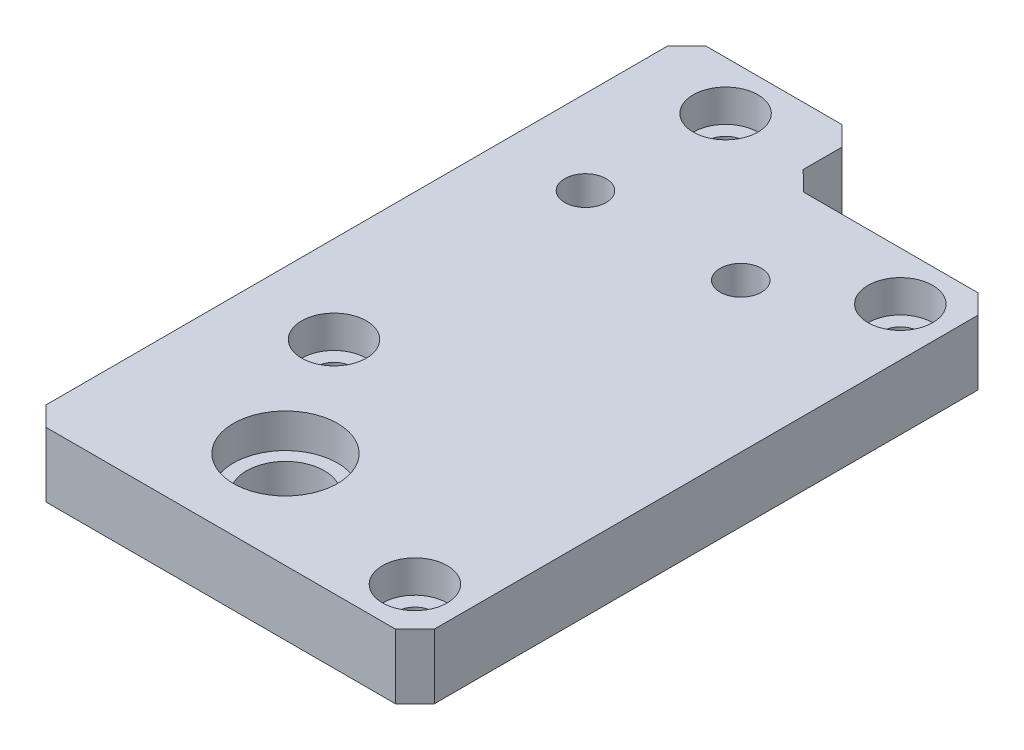
ISO-10303-21;
HEADER;
FILE_DESCRIPTION(('STEP AP214'),'2;1');
FILE_NAME('part.step','',(''),(''),'','','');
FILE_SCHEMA(('AUTOMOTIVE_DESIGN { 1 0 10303 214 1 1 1 1 }'));
ENDSEC;
DATA;
#1=APPLICATION_CONTEXT('core data for automotive mechanical design processes');
#2=APPLICATION_PROTOCOL_DEFINITION('international standard','automotive_design',2000,#1);
#3=PRODUCT_CONTEXT('',#1,'mechanical');
#4=PRODUCT('Part','Part','',(#3));
#5=PRODUCT_RELATED_PRODUCT_CATEGORY('part','',(#4));
#6=PRODUCT_DEFINITION_FORMATION('','',#4);
#7=PRODUCT_DEFINITION_CONTEXT('part definition',#1,'design');
#8=PRODUCT_DEFINITION('design','',#6,#7);
#9=PRODUCT_DEFINITION_SHAPE('','',#8);
#10=(LENGTH_UNIT() NAMED_UNIT(*) SI_UNIT(.MILLI.,.METRE.));
#11=(NAMED_UNIT(*) PLANE_ANGLE_UNIT() SI_UNIT($,.RADIAN.));
#12=(NAMED_UNIT(*) SI_UNIT($,.STERADIAN.) SOLID_ANGLE_UNIT());
#13=UNCERTAINTY_MEASURE_WITH_UNIT(LENGTH_MEASURE(1.E-05),#10,'distance_accuracy_value','');
#14=(GEOMETRIC_REPRESENTATION_CONTEXT(3) GLOBAL_UNCERTAINTY_ASSIGNED_CONTEXT((#13)) GLOBAL_UNIT_ASSIGNED_CONTEXT((#10,
#11,#12)) REPRESENTATION_CONTEXT('',''));
#15=CARTESIAN_POINT('',(0.,0.,0.));
#16=DIRECTION('',(0.,0.,1.));
#17=DIRECTION('',(1.,0.,0.));
#18=AXIS2_PLACEMENT_3D('',#15,#16,#17);
#19=CARTESIAN_POINT('',(35.,10.,-135.));
#20=DIRECTION('',(-1.,0.,0.));
#21=DIRECTION('',(0.,0.,-1.));
#22=AXIS2_PLACEMENT_3D('',#19,#20,#21);
#23=PLANE('',#22);
#24=DIRECTION('',(0.,0.,1.));
#25=VECTOR('',#24,1.);
#26=CARTESIAN_POINT('',(35.,0.,-135.));
#27=LINE('',#26,#25);
#28=CARTESIAN_POINT('',(35.,0.,-132.));
#29=VERTEX_POINT('',#28);
#30=CARTESIAN_POINT('',(35.,0.,-48.0000000000001));
#31=VERTEX_POINT('',#30);
#32=EDGE_CURVE('E143',#29,#31,#27,.T.);
#33=ORIENTED_EDGE('',*,*,#32,.F.);
#34=DIRECTION('',(0.,-1.,0.));
#35=VECTOR('',#34,1.);
#36=CARTESIAN_POINT('',(35.,10.,-132.));
#37=LINE('',#36,#35);
#38=CARTESIAN_POINT('',(35.,10.,-132.));
#39=VERTEX_POINT('',#38);
#40=EDGE_CURVE('E148',#39,#29,#37,.T.);
#41=ORIENTED_EDGE('',*,*,#40,.F.);
#42=DIRECTION('',(0.,0.,1.));
#43=VECTOR('',#42,1.);
#44=CARTESIAN_POINT('',(35.,10.,-135.));
#45=LINE('',#44,#43);
#46=CARTESIAN_POINT('',(35.,10.,-48.0000000000001));
#47=VERTEX_POINT('',#46);
#48=EDGE_CURVE('E187',#39,#47,#45,.T.);
#49=ORIENTED_EDGE('',*,*,#48,.T.);
#50=DIRECTION('',(0.,1.,0.));
#51=VECTOR('',#50,1.);
#52=CARTESIAN_POINT('',(35.,10.,-48.));
#53=LINE('',#52,#51);
#54=EDGE_CURVE('E204',#31,#47,#53,.T.);
#55=ORIENTED_EDGE('',*,*,#54,.F.);
#56=EDGE_LOOP('',(#33,#41,#49,#55));
#57=FACE_BOUND('',#56,.T.);
#58=ADVANCED_FACE('F47',(#57),#23,.F.);
#59=CARTESIAN_POINT('',(-25.,10.,-45.));
#60=DIRECTION('',(0.,0.,-1.));
#61=DIRECTION('',(1.,0.,0.));
#62=AXIS2_PLACEMENT_3D('',#59,#60,#61);
#63=PLANE('',#62);
#64=DIRECTION('',(-1.,0.,0.));
#65=VECTOR('',#64,1.);
#66=CARTESIAN_POINT('',(-25.,10.,-45.));
#67=LINE('',#66,#65);
#68=CARTESIAN_POINT('',(32.,10.,-45.));
#69=VERTEX_POINT('',#68);
#70=CARTESIAN_POINT('',(-22.,10.,-45.));
#71=VERTEX_POINT('',#70);
#72=EDGE_CURVE('E279',#69,#71,#67,.T.);
#73=ORIENTED_EDGE('',*,*,#72,.T.);
#74=DIRECTION('',(0.,1.,0.));
#75=VECTOR('',#74,1.);
#76=CARTESIAN_POINT('',(-22.,10.,-45.));
#77=LINE('',#76,#75);
#78=CARTESIAN_POINT('',(-22.,0.,-45.));
#79=VERTEX_POINT('',#78);
#80=EDGE_CURVE('E160',#79,#71,#77,.T.);
#81=ORIENTED_EDGE('',*,*,#80,.F.);
#82=DIRECTION('',(-1.,0.,0.));
#83=VECTOR('',#82,1.);
#84=CARTESIAN_POINT('',(-25.,0.,-45.));
#85=LINE('',#84,#83);
#86=CARTESIAN_POINT('',(32.,0.,-45.));
#87=VERTEX_POINT('',#86);
#88=EDGE_CURVE('E140',#87,#79,#85,.T.);
#89=ORIENTED_EDGE('',*,*,#88,.F.);
#90=DIRECTION('',(0.,-1.,0.));
#91=VECTOR('',#90,1.);
#92=CARTESIAN_POINT('',(32.,10.,-45.));
#93=LINE('',#92,#91);
#94=EDGE_CURVE('E152',#69,#87,#93,.T.);
#95=ORIENTED_EDGE('',*,*,#94,.F.);
#96=EDGE_LOOP('',(#73,#81,#89,#95));
#97=FACE_BOUND('',#96,.T.);
#98=ADVANCED_FACE('F162',(#97),#63,.F.);
#99=CARTESIAN_POINT('',(-25.,10.,-45.));
#100=DIRECTION('',(1.,0.,0.));
#101=DIRECTION('',(0.,0.,1.));
#102=AXIS2_PLACEMENT_3D('',#99,#100,#101);
#103=PLANE('',#102);
#104=DIRECTION('',(0.,0.,-1.));
#105=VECTOR('',#104,1.);
#106=CARTESIAN_POINT('',(-25.,0.,-45.));
#107=LINE('',#106,#105);
#108=CARTESIAN_POINT('',(-25.,0.,-48.));
#109=VERTEX_POINT('',#108);
#110=CARTESIAN_POINT('',(-25.,0.,-144.));
#111=VERTEX_POINT('',#110);
#112=EDGE_CURVE('E165',#109,#111,#107,.T.);
#113=ORIENTED_EDGE('',*,*,#112,.F.);
#114=DIRECTION('',(0.,-1.,0.));
#115=VECTOR('',#114,1.);
#116=CARTESIAN_POINT('',(-25.,10.,-48.));
#117=LINE('',#116,#115);
#118=CARTESIAN_POINT('',(-25.,10.,-48.));
#119=VERTEX_POINT('',#118);
#120=EDGE_CURVE('E241',#119,#109,#117,.T.);
#121=ORIENTED_EDGE('',*,*,#120,.F.);
#122=DIRECTION('',(0.,0.,-1.));
#123=VECTOR('',#122,1.);
#124=CARTESIAN_POINT('',(-25.,10.,-45.));
#125=LINE('',#124,#123);
#126=CARTESIAN_POINT('',(-25.,10.,-144.));
#127=VERTEX_POINT('',#126);
#128=EDGE_CURVE('E273',#119,#127,#125,.T.);
#129=ORIENTED_EDGE('',*,*,#128,.T.);
#130=DIRECTION('',(0.,1.,0.));
#131=VECTOR('',#130,1.);
#132=CARTESIAN_POINT('',(-25.,10.,-144.));
#133=LINE('',#132,#131);
#134=EDGE_CURVE('E245',#111,#127,#133,.T.);
#135=ORIENTED_EDGE('',*,*,#134,.F.);
#136=EDGE_LOOP('',(#113,#121,#129,#135));
#137=FACE_BOUND('',#136,.T.);
#138=ADVANCED_FACE('F434',(#137),#103,.F.);
#139=CARTESIAN_POINT('',(-25.,10.,-147.));
#140=DIRECTION('',(0.,0.,1.));
#141=DIRECTION('',(-1.,0.,0.));
#142=AXIS2_PLACEMENT_3D('',#139,#140,#141);
#143=PLANE('',#142);
#144=DIRECTION('',(1.,0.,0.));
#145=VECTOR('',#144,1.);
#146=CARTESIAN_POINT('',(-25.,0.,-147.));
#147=LINE('',#146,#145);
#148=CARTESIAN_POINT('',(-22.,0.,-147.));
#149=VERTEX_POINT('',#148);
#150=CARTESIAN_POINT('',(-1.00000000000001,0.,-147.));
#151=VERTEX_POINT('',#150);
#152=EDGE_CURVE('E170',#149,#151,#147,.T.);
#153=ORIENTED_EDGE('',*,*,#152,.F.);
#154=DIRECTION('',(0.,-1.,0.));
#155=VECTOR('',#154,1.);
#156=CARTESIAN_POINT('',(-22.,10.,-147.));
#157=LINE('',#156,#155);
#158=CARTESIAN_POINT('',(-22.,10.,-147.));
#159=VERTEX_POINT('',#158);
#160=EDGE_CURVE('E233',#159,#149,#157,.T.);
#161=ORIENTED_EDGE('',*,*,#160,.F.);
#162=DIRECTION('',(1.,0.,0.));
#163=VECTOR('',#162,1.);
#164=CARTESIAN_POINT('',(-25.,10.,-147.));
#165=LINE('',#164,#163);
#166=CARTESIAN_POINT('',(-1.00000000000001,10.,-147.));
#167=VERTEX_POINT('',#166);
#168=EDGE_CURVE('E268',#159,#167,#165,.T.);
#169=ORIENTED_EDGE('',*,*,#168,.T.);
#170=DIRECTION('',(0.,1.,0.));
#171=VECTOR('',#170,1.);
#172=CARTESIAN_POINT('',(-1.00000000000001,10.,-147.));
#173=LINE('',#172,#171);
#174=EDGE_CURVE('E237',#151,#167,#173,.T.);
#175=ORIENTED_EDGE('',*,*,#174,.F.);
#176=EDGE_LOOP('',(#153,#161,#169,#175));
#177=FACE_BOUND('',#176,.T.);
#178=ADVANCED_FACE('F458',(#177),#143,.F.);
#179=CARTESIAN_POINT('',(2.00000000000002,10.,-147.));
#180=DIRECTION('',(-1.,0.,0.));
#181=DIRECTION('',(0.,0.,-1.));
#182=AXIS2_PLACEMENT_3D('',#179,#180,#181);
#183=PLANE('',#182);
#184=DIRECTION('',(0.,0.,1.));
#185=VECTOR('',#184,1.);
#186=CARTESIAN_POINT('',(2.00000000000002,0.,-147.));
#187=LINE('',#186,#185);
#188=CARTESIAN_POINT('',(2.00000000000002,0.,-144.));
#189=VERTEX_POINT('',#188);
#190=CARTESIAN_POINT('',(2.00000000000002,0.,-138.));
#191=VERTEX_POINT('',#190);
#192=EDGE_CURVE('E179',#189,#191,#187,.T.);
#193=ORIENTED_EDGE('',*,*,#192,.F.);
#194=DIRECTION('',(0.,-1.,0.));
#195=VECTOR('',#194,1.);
#196=CARTESIAN_POINT('',(2.00000000000002,10.,-144.));
#197=LINE('',#196,#195);
#198=CARTESIAN_POINT('',(2.00000000000002,10.,-144.));
#199=VERTEX_POINT('',#198);
#200=EDGE_CURVE('E226',#199,#189,#197,.T.);
#201=ORIENTED_EDGE('',*,*,#200,.F.);
#202=DIRECTION('',(0.,0.,1.));
#203=VECTOR('',#202,1.);
#204=CARTESIAN_POINT('',(2.00000000000002,10.,-147.));
#205=LINE('',#204,#203);
#206=CARTESIAN_POINT('',(2.00000000000002,10.,-138.));
#207=VERTEX_POINT('',#206);
#208=EDGE_CURVE('E259',#199,#207,#205,.T.);
#209=ORIENTED_EDGE('',*,*,#208,.T.);
#210=DIRECTION('',(0.,1.,0.));
#211=VECTOR('',#210,1.);
#212=CARTESIAN_POINT('',(2.00000000000002,10.,-138.));
#213=LINE('',#212,#211);
#214=EDGE_CURVE('E230',#191,#207,#213,.T.);
#215=ORIENTED_EDGE('',*,*,#214,.F.);
#216=EDGE_LOOP('',(#193,#201,#209,#215));
#217=FACE_BOUND('',#216,.T.);
#218=ADVANCED_FACE('F256',(#217),#183,.F.);
#219=CARTESIAN_POINT('',(2.00000000000002,10.,-135.));
#220=DIRECTION('',(0.,0.,1.));
#221=DIRECTION('',(-1.,0.,0.));
#222=AXIS2_PLACEMENT_3D('',#219,#220,#221);
#223=PLANE('',#222);
#224=DIRECTION('',(1.,0.,0.));
#225=VECTOR('',#224,1.);
#226=CARTESIAN_POINT('',(2.00000000000002,0.,-135.));
#227=LINE('',#226,#225);
#228=CARTESIAN_POINT('',(5.00000000000004,0.,-135.));
#229=VERTEX_POINT('',#228);
#230=CARTESIAN_POINT('',(32.,0.,-135.));
#231=VERTEX_POINT('',#230);
#232=EDGE_CURVE('E183',#229,#231,#227,.T.);
#233=ORIENTED_EDGE('',*,*,#232,.F.);
#234=DIRECTION('',(0.,-1.,0.));
#235=VECTOR('',#234,1.);
#236=CARTESIAN_POINT('',(5.00000000000004,0.,-135.));
#237=LINE('',#236,#235);
#238=CARTESIAN_POINT('',(5.00000000000004,10.,-135.));
#239=VERTEX_POINT('',#238);
#240=EDGE_CURVE('E220',#239,#229,#237,.T.);
#241=ORIENTED_EDGE('',*,*,#240,.F.);
#242=DIRECTION('',(1.,0.,0.));
#243=VECTOR('',#242,1.);
#244=CARTESIAN_POINT('',(2.00000000000002,10.,-135.));
#245=LINE('',#244,#243);
#246=CARTESIAN_POINT('',(32.,10.,-135.));
#247=VERTEX_POINT('',#246);
#248=EDGE_CURVE('E189',#239,#247,#245,.T.);
#249=ORIENTED_EDGE('',*,*,#248,.T.);
#250=DIRECTION('',(0.,1.,0.));
#251=VECTOR('',#250,1.);
#252=CARTESIAN_POINT('',(32.,10.,-135.));
#253=LINE('',#252,#251);
#254=EDGE_CURVE('E223',#231,#247,#253,.T.);
#255=ORIENTED_EDGE('',*,*,#254,.F.);
#256=EDGE_LOOP('',(#233,#241,#249,#255));
#257=FACE_BOUND('',#256,.T.);
#258=ADVANCED_FACE('F419',(#257),#223,.F.);
#259=CARTESIAN_POINT('',(0.,10.,-90.));
#260=DIRECTION('',(0.,-1.,0.));
#261=DIRECTION('',(0.,0.,1.));
#262=AXIS2_PLACEMENT_3D('',#259,#260,#261);
#263=PLANE('',#262);
#264=CARTESIAN_POINT('',(12.,10.,-118.35));
#265=DIRECTION('',(0.,-1.,0.));
#266=DIRECTION('',(0.,0.,-1.));
#267=AXIS2_PLACEMENT_3D('',#264,#265,#266);
#268=CIRCLE('',#267,3.2);
#269=CARTESIAN_POINT('',(12.,10.,-121.55));
#270=VERTEX_POINT('',#269);
#271=EDGE_CURVE('E373',#270,#270,#268,.T.);
#272=ORIENTED_EDGE('',*,*,#271,.T.);
#273=EDGE_LOOP('',(#272));
#274=FACE_BOUND('',#273,.T.);
#275=CARTESIAN_POINT('',(-12.,10.,-118.35));
#276=DIRECTION('',(0.,-1.,0.));
#277=DIRECTION('',(0.,0.,-1.));
#278=AXIS2_PLACEMENT_3D('',#275,#276,#277);
#279=CIRCLE('',#278,3.2);
#280=CARTESIAN_POINT('',(-12.,10.,-121.55));
#281=VERTEX_POINT('',#280);
#282=EDGE_CURVE('E369',#281,#281,#279,.T.);
#283=ORIENTED_EDGE('',*,*,#282,.T.);
#284=EDGE_LOOP('',(#283));
#285=FACE_BOUND('',#284,.T.);
#286=CARTESIAN_POINT('',(0.,10.,-60.));
#287=DIRECTION('',(0.,-1.,0.));
#288=DIRECTION('',(0.,0.,-1.));
#289=AXIS2_PLACEMENT_3D('',#286,#287,#288);
#290=CIRCLE('',#289,8.05);
#291=CARTESIAN_POINT('',(0.,10.,-68.05));
#292=VERTEX_POINT('',#291);
#293=EDGE_CURVE('E352',#292,#292,#290,.T.);
#294=ORIENTED_EDGE('',*,*,#293,.T.);
#295=EDGE_LOOP('',(#294));
#296=FACE_BOUND('',#295,.T.);
#297=CARTESIAN_POINT('',(27.5,10.,-52.5));
#298=DIRECTION('',(0.,-1.,0.));
#299=DIRECTION('',(0.,0.,-1.));
#300=AXIS2_PLACEMENT_3D('',#297,#298,#299);
#301=CIRCLE('',#300,5.);
#302=CARTESIAN_POINT('',(27.5,10.,-57.5));
#303=VERTEX_POINT('',#302);
#304=EDGE_CURVE('E344',#303,#303,#301,.T.);
#305=ORIENTED_EDGE('',*,*,#304,.T.);
#306=EDGE_LOOP('',(#305));
#307=FACE_BOUND('',#306,.T.);
#308=CARTESIAN_POINT('',(27.5,10.,-127.5));
#309=DIRECTION('',(0.,-1.,0.));
#310=DIRECTION('',(0.,0.,-1.));
#311=AXIS2_PLACEMENT_3D('',#308,#309,#310);
#312=CIRCLE('',#311,5.);
#313=CARTESIAN_POINT('',(27.5,10.,-132.5));
#314=VERTEX_POINT('',#313);
#315=EDGE_CURVE('E328',#314,#314,#312,.T.);
#316=ORIENTED_EDGE('',*,*,#315,.T.);
#317=EDGE_LOOP('',(#316));
#318=FACE_BOUND('',#317,.T.);
#319=CARTESIAN_POINT('',(-11.5,10.,-79.));
#320=DIRECTION('',(0.,-1.,0.));
#321=DIRECTION('',(0.,0.,-1.));
#322=AXIS2_PLACEMENT_3D('',#319,#320,#321);
#323=CIRCLE('',#322,5.);
#324=CARTESIAN_POINT('',(-11.5,10.,-84.));
#325=VERTEX_POINT('',#324);
#326=EDGE_CURVE('E312',#325,#325,#323,.T.);
#327=ORIENTED_EDGE('',*,*,#326,.T.);
#328=EDGE_LOOP('',(#327));
#329=FACE_BOUND('',#328,.T.);
#330=CARTESIAN_POINT('',(-11.5,10.,-139.5));
#331=DIRECTION('',(0.,-1.,0.));
#332=DIRECTION('',(0.,0.,-1.));
#333=AXIS2_PLACEMENT_3D('',#330,#331,#332);
#334=CIRCLE('',#333,5.);
#335=CARTESIAN_POINT('',(-11.5,10.,-144.5));
#336=VERTEX_POINT('',#335);
#337=EDGE_CURVE('E296',#336,#336,#334,.T.);
#338=ORIENTED_EDGE('',*,*,#337,.T.);
#339=EDGE_LOOP('',(#338));
#340=FACE_BOUND('',#339,.T.);
#341=ORIENTED_EDGE('',*,*,#48,.F.);
#342=DIRECTION('',(-0.707106781186549,0.,-0.707106781186546));
#343=VECTOR('',#342,1.);
#344=CARTESIAN_POINT('',(35.,10.,-132.));
#345=LINE('',#344,#343);
#346=EDGE_CURVE('E63',#247,#39,#345,.F.);
#347=ORIENTED_EDGE('',*,*,#346,.F.);
#348=ORIENTED_EDGE('',*,*,#248,.F.);
#349=DIRECTION('',(-0.707106781186551,0.,-0.707106781186544));
#350=VECTOR('',#349,1.);
#351=CARTESIAN_POINT('',(25.,10.,-115.));
#352=LINE('',#351,#350);
#353=EDGE_CURVE('E11',#207,#239,#352,.F.);
#354=ORIENTED_EDGE('',*,*,#353,.F.);
#355=ORIENTED_EDGE('',*,*,#208,.F.);
#356=DIRECTION('',(-0.707106781186551,0.,-0.707106781186544));
#357=VECTOR('',#356,1.);
#358=CARTESIAN_POINT('',(2.00000000000002,10.,-144.));
#359=LINE('',#358,#357);
#360=EDGE_CURVE('E213',#167,#199,#359,.F.);
#361=ORIENTED_EDGE('',*,*,#360,.F.);
#362=ORIENTED_EDGE('',*,*,#168,.F.);
#363=DIRECTION('',(-0.707106781186545,0.,0.70710678118655));
#364=VECTOR('',#363,1.);
#365=CARTESIAN_POINT('',(-22.,10.,-147.));
#366=LINE('',#365,#364);
#367=EDGE_CURVE('E210',#127,#159,#366,.F.);
#368=ORIENTED_EDGE('',*,*,#367,.F.);
#369=ORIENTED_EDGE('',*,*,#128,.F.);
#370=DIRECTION('',(0.707106781186549,0.,0.707106781186546));
#371=VECTOR('',#370,1.);
#372=CARTESIAN_POINT('',(-25.,10.,-48.));
#373=LINE('',#372,#371);
#374=EDGE_CURVE('E207',#71,#119,#373,.F.);
#375=ORIENTED_EDGE('',*,*,#374,.F.);
#376=ORIENTED_EDGE('',*,*,#72,.F.);
#377=DIRECTION('',(0.707106781186544,0.,-0.707106781186551));
#378=VECTOR('',#377,1.);
#379=CARTESIAN_POINT('',(32.,10.,-45.));
#380=LINE('',#379,#378);
#381=EDGE_CURVE('E154',#47,#69,#380,.F.);
#382=ORIENTED_EDGE('',*,*,#381,.F.);
#383=EDGE_LOOP('',(#341,#347,#348,#354,#355,#361,#362,#368,#369,#375,#376,#382));
#384=FACE_BOUND('',#383,.T.);
#385=ADVANCED_FACE('F266',(#274,#285,#296,#307,#318,#329,#340,#384),#263,.F.);
#386=CARTESIAN_POINT('',(0.,0.,-90.));
#387=DIRECTION('',(0.,-1.,0.));
#388=DIRECTION('',(0.,0.,1.));
#389=AXIS2_PLACEMENT_3D('',#386,#387,#388);
#390=PLANE('',#389);
#391=CARTESIAN_POINT('',(12.,0.,-118.35));
#392=DIRECTION('',(0.,-1.,0.));
#393=DIRECTION('',(0.,0.,-1.));
#394=AXIS2_PLACEMENT_3D('',#391,#392,#393);
#395=CIRCLE('',#394,3.2);
#396=CARTESIAN_POINT('',(12.,0.,-121.55));
#397=VERTEX_POINT('',#396);
#398=EDGE_CURVE('E364',#397,#397,#395,.T.);
#399=ORIENTED_EDGE('',*,*,#398,.F.);
#400=EDGE_LOOP('',(#399));
#401=FACE_BOUND('',#400,.T.);
#402=CARTESIAN_POINT('',(-12.,0.,-118.35));
#403=DIRECTION('',(0.,-1.,0.));
#404=DIRECTION('',(0.,0.,-1.));
#405=AXIS2_PLACEMENT_3D('',#402,#403,#404);
#406=CIRCLE('',#405,3.2);
#407=CARTESIAN_POINT('',(-12.,0.,-121.55));
#408=VERTEX_POINT('',#407);
#409=EDGE_CURVE('E365',#408,#408,#406,.T.);
#410=ORIENTED_EDGE('',*,*,#409,.F.);
#411=EDGE_LOOP('',(#410));
#412=FACE_BOUND('',#411,.T.);
#413=CARTESIAN_POINT('',(0.,0.,-60.));
#414=DIRECTION('',(0.,-1.,0.));
#415=DIRECTION('',(0.,0.,-1.));
#416=AXIS2_PLACEMENT_3D('',#413,#414,#415);
#417=CIRCLE('',#416,6.);
#418=CARTESIAN_POINT('',(0.,0.,-66.));
#419=VERTEX_POINT('',#418);
#420=EDGE_CURVE('E356',#419,#419,#417,.T.);
#421=ORIENTED_EDGE('',*,*,#420,.F.);
#422=EDGE_LOOP('',(#421));
#423=FACE_BOUND('',#422,.T.);
#424=CARTESIAN_POINT('',(27.5,0.,-52.5));
#425=DIRECTION('',(0.,-1.,0.));
#426=DIRECTION('',(0.,0.,-1.));
#427=AXIS2_PLACEMENT_3D('',#424,#425,#426);
#428=CIRCLE('',#427,2.75000000000001);
#429=CARTESIAN_POINT('',(27.5,0.,-55.25));
#430=VERTEX_POINT('',#429);
#431=EDGE_CURVE('E332',#430,#430,#428,.T.);
#432=ORIENTED_EDGE('',*,*,#431,.F.);
#433=EDGE_LOOP('',(#432));
#434=FACE_BOUND('',#433,.T.);
#435=CARTESIAN_POINT('',(27.5,0.,-127.5));
#436=DIRECTION('',(0.,-1.,0.));
#437=DIRECTION('',(0.,0.,-1.));
#438=AXIS2_PLACEMENT_3D('',#435,#436,#437);
#439=CIRCLE('',#438,2.75000000000001);
#440=CARTESIAN_POINT('',(27.5,0.,-130.25));
#441=VERTEX_POINT('',#440);
#442=EDGE_CURVE('E316',#441,#441,#439,.T.);
#443=ORIENTED_EDGE('',*,*,#442,.F.);
#444=EDGE_LOOP('',(#443));
#445=FACE_BOUND('',#444,.T.);
#446=CARTESIAN_POINT('',(-11.5,0.,-79.));
#447=DIRECTION('',(0.,-1.,0.));
#448=DIRECTION('',(0.,0.,-1.));
#449=AXIS2_PLACEMENT_3D('',#446,#447,#448);
#450=CIRCLE('',#449,2.75000000000001);
#451=CARTESIAN_POINT('',(-11.5,0.,-81.75));
#452=VERTEX_POINT('',#451);
#453=EDGE_CURVE('E300',#452,#452,#450,.T.);
#454=ORIENTED_EDGE('',*,*,#453,.F.);
#455=EDGE_LOOP('',(#454));
#456=FACE_BOUND('',#455,.T.);
#457=CARTESIAN_POINT('',(-11.5,0.,-139.5));
#458=DIRECTION('',(0.,-1.,0.));
#459=DIRECTION('',(0.,0.,-1.));
#460=AXIS2_PLACEMENT_3D('',#457,#458,#459);
#461=CIRCLE('',#460,2.75000000000001);
#462=CARTESIAN_POINT('',(-11.5,0.,-142.25));
#463=VERTEX_POINT('',#462);
#464=EDGE_CURVE('E172',#463,#463,#461,.T.);
#465=ORIENTED_EDGE('',*,*,#464,.F.);
#466=EDGE_LOOP('',(#465));
#467=FACE_BOUND('',#466,.T.);
#468=ORIENTED_EDGE('',*,*,#88,.T.);
#469=DIRECTION('',(-0.707106781186549,0.,-0.707106781186546));
#470=VECTOR('',#469,1.);
#471=CARTESIAN_POINT('',(-33.4999999999999,0.,-56.4999999999999));
#472=LINE('',#471,#470);
#473=EDGE_CURVE('E159',#109,#79,#472,.F.);
#474=ORIENTED_EDGE('',*,*,#473,.F.);
#475=ORIENTED_EDGE('',*,*,#112,.T.);
#476=DIRECTION('',(0.707106781186545,0.,-0.70710678118655));
#477=VECTOR('',#476,1.);
#478=CARTESIAN_POINT('',(-39.5000000000001,0.,-129.5));
#479=LINE('',#478,#477);
#480=EDGE_CURVE('E193',#149,#111,#479,.F.);
#481=ORIENTED_EDGE('',*,*,#480,.F.);
#482=ORIENTED_EDGE('',*,*,#152,.T.);
#483=DIRECTION('',(0.707106781186551,0.,0.707106781186544));
#484=VECTOR('',#483,1.);
#485=CARTESIAN_POINT('',(28.,0.,-118.));
#486=LINE('',#485,#484);
#487=EDGE_CURVE('E196',#189,#151,#486,.F.);
#488=ORIENTED_EDGE('',*,*,#487,.F.);
#489=ORIENTED_EDGE('',*,*,#192,.T.);
#490=DIRECTION('',(0.707106781186551,0.,0.707106781186544));
#491=VECTOR('',#490,1.);
#492=CARTESIAN_POINT('',(5.00000000000004,0.,-135.));
#493=LINE('',#492,#491);
#494=EDGE_CURVE('E56',#229,#191,#493,.F.);
#495=ORIENTED_EDGE('',*,*,#494,.F.);
#496=ORIENTED_EDGE('',*,*,#232,.T.);
#497=DIRECTION('',(0.707106781186549,0.,0.707106781186546));
#498=VECTOR('',#497,1.);
#499=CARTESIAN_POINT('',(38.4999999999999,0.,-128.5));
#500=LINE('',#499,#498);
#501=EDGE_CURVE('E149',#29,#231,#500,.F.);
#502=ORIENTED_EDGE('',*,*,#501,.F.);
#503=ORIENTED_EDGE('',*,*,#32,.T.);
#504=DIRECTION('',(-0.707106781186544,0.,0.707106781186551));
#505=VECTOR('',#504,1.);
#506=CARTESIAN_POINT('',(38.5000000000001,0.,-51.5000000000002));
#507=LINE('',#506,#505);
#508=EDGE_CURVE('E136',#87,#31,#507,.F.);
#509=ORIENTED_EDGE('',*,*,#508,.F.);
#510=EDGE_LOOP('',(#468,#474,#475,#481,#482,#488,#489,#495,#496,#502,#503,#509));
#511=FACE_BOUND('',#510,.T.);
#512=ADVANCED_FACE('F138',(#401,#412,#423,#434,#445,#456,#467,#511),#390,.T.);
#513=CARTESIAN_POINT('',(-11.5,10.,-139.5));
#514=DIRECTION('',(0.,1.,0.));
#515=DIRECTION('',(0.,0.,-1.));
#516=AXIS2_PLACEMENT_3D('',#513,#514,#515);
#517=CYLINDRICAL_SURFACE('',#516,2.75);
#518=ORIENTED_EDGE('',*,*,#464,.T.);
#519=EDGE_LOOP('',(#518));
#520=FACE_BOUND('',#519,.T.);
#521=CARTESIAN_POINT('',(-11.5,5.,-139.5));
#522=DIRECTION('',(0.,-1.,0.));
#523=DIRECTION('',(0.,0.,-1.));
#524=AXIS2_PLACEMENT_3D('',#521,#522,#523);
#525=CIRCLE('',#524,2.75);
#526=CARTESIAN_POINT('',(-11.5,5.,-142.25));
#527=VERTEX_POINT('',#526);
#528=EDGE_CURVE('E288',#527,#527,#525,.T.);
#529=ORIENTED_EDGE('',*,*,#528,.F.);
#530=EDGE_LOOP('',(#529));
#531=FACE_BOUND('',#530,.T.);
#532=ADVANCED_FACE('F386',(#520,#531),#517,.F.);
#533=CARTESIAN_POINT('',(-8.74999999999998,5.,-139.5));
#534=DIRECTION('',(0.,-1.,0.));
#535=DIRECTION('',(0.,0.,1.));
#536=AXIS2_PLACEMENT_3D('',#533,#534,#535);
#537=PLANE('',#536);
#538=ORIENTED_EDGE('',*,*,#528,.T.);
#539=EDGE_LOOP('',(#538));
#540=FACE_BOUND('',#539,.T.);
#541=CARTESIAN_POINT('',(-11.5,5.,-139.5));
#542=DIRECTION('',(0.,-1.,0.));
#543=DIRECTION('',(0.,0.,-1.));
#544=AXIS2_PLACEMENT_3D('',#541,#542,#543);
#545=CIRCLE('',#544,5.);
#546=CARTESIAN_POINT('',(-11.5,5.,-144.5));
#547=VERTEX_POINT('',#546);
#548=EDGE_CURVE('E292',#547,#547,#545,.T.);
#549=ORIENTED_EDGE('',*,*,#548,.F.);
#550=EDGE_LOOP('',(#549));
#551=FACE_BOUND('',#550,.T.);
#552=ADVANCED_FACE('F402',(#540,#551),#537,.F.);
#553=CARTESIAN_POINT('',(-11.5,10.,-139.5));
#554=DIRECTION('',(0.,1.,0.));
#555=DIRECTION('',(0.,0.,-1.));
#556=AXIS2_PLACEMENT_3D('',#553,#554,#555);
#557=CYLINDRICAL_SURFACE('',#556,5.);
#558=ORIENTED_EDGE('',*,*,#548,.T.);
#559=EDGE_LOOP('',(#558));
#560=FACE_BOUND('',#559,.T.);
#561=ORIENTED_EDGE('',*,*,#337,.F.);
#562=EDGE_LOOP('',(#561));
#563=FACE_BOUND('',#562,.T.);
#564=ADVANCED_FACE('F408',(#560,#563),#557,.F.);
#565=CARTESIAN_POINT('',(-11.5,10.,-79.));
#566=DIRECTION('',(0.,1.,0.));
#567=DIRECTION('',(0.,0.,-1.));
#568=AXIS2_PLACEMENT_3D('',#565,#566,#567);
#569=CYLINDRICAL_SURFACE('',#568,2.75);
#570=ORIENTED_EDGE('',*,*,#453,.T.);
#571=EDGE_LOOP('',(#570));
#572=FACE_BOUND('',#571,.T.);
#573=CARTESIAN_POINT('',(-11.5,5.,-79.));
#574=DIRECTION('',(0.,-1.,0.));
#575=DIRECTION('',(0.,0.,-1.));
#576=AXIS2_PLACEMENT_3D('',#573,#574,#575);
#577=CIRCLE('',#576,2.75);
#578=CARTESIAN_POINT('',(-11.5,5.,-81.75));
#579=VERTEX_POINT('',#578);
#580=EDGE_CURVE('E304',#579,#579,#577,.T.);
#581=ORIENTED_EDGE('',*,*,#580,.F.);
#582=EDGE_LOOP('',(#581));
#583=FACE_BOUND('',#582,.T.);
#584=ADVANCED_FACE('F414',(#572,#583),#569,.F.);
#585=CARTESIAN_POINT('',(-8.74999999999998,5.,-79.));
#586=DIRECTION('',(0.,-1.,0.));
#587=DIRECTION('',(0.,0.,1.));
#588=AXIS2_PLACEMENT_3D('',#585,#586,#587);
#589=PLANE('',#588);
#590=ORIENTED_EDGE('',*,*,#580,.T.);
#591=EDGE_LOOP('',(#590));
#592=FACE_BOUND('',#591,.T.);
#593=CARTESIAN_POINT('',(-11.5,5.,-79.));
#594=DIRECTION('',(0.,-1.,0.));
#595=DIRECTION('',(0.,0.,-1.));
#596=AXIS2_PLACEMENT_3D('',#593,#594,#595);
#597=CIRCLE('',#596,5.);
#598=CARTESIAN_POINT('',(-11.5,5.,-84.));
#599=VERTEX_POINT('',#598);
#600=EDGE_CURVE('E308',#599,#599,#597,.T.);
#601=ORIENTED_EDGE('',*,*,#600,.F.);
#602=EDGE_LOOP('',(#601));
#603=FACE_BOUND('',#602,.T.);
#604=ADVANCED_FACE('F624',(#592,#603),#589,.F.);
#605=CARTESIAN_POINT('',(-11.5,10.,-79.));
#606=DIRECTION('',(0.,1.,0.));
#607=DIRECTION('',(0.,0.,-1.));
#608=AXIS2_PLACEMENT_3D('',#605,#606,#607);
#609=CYLINDRICAL_SURFACE('',#608,5.);
#610=ORIENTED_EDGE('',*,*,#600,.T.);
#611=EDGE_LOOP('',(#610));
#612=FACE_BOUND('',#611,.T.);
#613=ORIENTED_EDGE('',*,*,#326,.F.);
#614=EDGE_LOOP('',(#613));
#615=FACE_BOUND('',#614,.T.);
#616=ADVANCED_FACE('F614',(#612,#615),#609,.F.);
#617=CARTESIAN_POINT('',(27.5,10.,-127.5));
#618=DIRECTION('',(0.,1.,0.));
#619=DIRECTION('',(0.,0.,-1.));
#620=AXIS2_PLACEMENT_3D('',#617,#618,#619);
#621=CYLINDRICAL_SURFACE('',#620,2.75);
#622=ORIENTED_EDGE('',*,*,#442,.T.);
#623=EDGE_LOOP('',(#622));
#624=FACE_BOUND('',#623,.T.);
#625=CARTESIAN_POINT('',(27.5,5.,-127.5));
#626=DIRECTION('',(0.,-1.,0.));
#627=DIRECTION('',(0.,0.,-1.));
#628=AXIS2_PLACEMENT_3D('',#625,#626,#627);
#629=CIRCLE('',#628,2.75);
#630=CARTESIAN_POINT('',(27.5,5.,-130.25));
#631=VERTEX_POINT('',#630);
#632=EDGE_CURVE('E320',#631,#631,#629,.T.);
#633=ORIENTED_EDGE('',*,*,#632,.F.);
#634=EDGE_LOOP('',(#633));
#635=FACE_BOUND('',#634,.T.);
#636=ADVANCED_FACE('F604',(#624,#635),#621,.F.);
#637=CARTESIAN_POINT('',(30.25,5.,-127.5));
#638=DIRECTION('',(0.,-1.,0.));
#639=DIRECTION('',(0.,0.,1.));
#640=AXIS2_PLACEMENT_3D('',#637,#638,#639);
#641=PLANE('',#640);
#642=ORIENTED_EDGE('',*,*,#632,.T.);
#643=EDGE_LOOP('',(#642));
#644=FACE_BOUND('',#643,.T.);
#645=CARTESIAN_POINT('',(27.5,5.,-127.5));
#646=DIRECTION('',(0.,-1.,0.));
#647=DIRECTION('',(0.,0.,-1.));
#648=AXIS2_PLACEMENT_3D('',#645,#646,#647);
#649=CIRCLE('',#648,5.);
#650=CARTESIAN_POINT('',(27.5,5.,-132.5));
#651=VERTEX_POINT('',#650);
#652=EDGE_CURVE('E324',#651,#651,#649,.T.);
#653=ORIENTED_EDGE('',*,*,#652,.F.);
#654=EDGE_LOOP('',(#653));
#655=FACE_BOUND('',#654,.T.);
#656=ADVANCED_FACE('F594',(#644,#655),#641,.F.);
#657=CARTESIAN_POINT('',(27.5,10.,-127.5));
#658=DIRECTION('',(0.,1.,0.));
#659=DIRECTION('',(0.,0.,-1.));
#660=AXIS2_PLACEMENT_3D('',#657,#658,#659);
#661=CYLINDRICAL_SURFACE('',#660,5.);
#662=ORIENTED_EDGE('',*,*,#652,.T.);
#663=EDGE_LOOP('',(#662));
#664=FACE_BOUND('',#663,.T.);
#665=ORIENTED_EDGE('',*,*,#315,.F.);
#666=EDGE_LOOP('',(#665));
#667=FACE_BOUND('',#666,.T.);
#668=ADVANCED_FACE('F584',(#664,#667),#661,.F.);
#669=CARTESIAN_POINT('',(27.5,10.,-52.5));
#670=DIRECTION('',(0.,1.,0.));
#671=DIRECTION('',(0.,0.,-1.));
#672=AXIS2_PLACEMENT_3D('',#669,#670,#671);
#673=CYLINDRICAL_SURFACE('',#672,2.75);
#674=ORIENTED_EDGE('',*,*,#431,.T.);
#675=EDGE_LOOP('',(#674));
#676=FACE_BOUND('',#675,.T.);
#677=CARTESIAN_POINT('',(27.5,5.,-52.5));
#678=DIRECTION('',(0.,-1.,0.));
#679=DIRECTION('',(0.,0.,-1.));
#680=AXIS2_PLACEMENT_3D('',#677,#678,#679);
#681=CIRCLE('',#680,2.75);
#682=CARTESIAN_POINT('',(27.5,5.,-55.25));
#683=VERTEX_POINT('',#682);
#684=EDGE_CURVE('E336',#683,#683,#681,.T.);
#685=ORIENTED_EDGE('',*,*,#684,.F.);
#686=EDGE_LOOP('',(#685));
#687=FACE_BOUND('',#686,.T.);
#688=ADVANCED_FACE('F574',(#676,#687),#673,.F.);
#689=CARTESIAN_POINT('',(30.25,5.,-52.5));
#690=DIRECTION('',(0.,-1.,0.));
#691=DIRECTION('',(0.,0.,1.));
#692=AXIS2_PLACEMENT_3D('',#689,#690,#691);
#693=PLANE('',#692);
#694=ORIENTED_EDGE('',*,*,#684,.T.);
#695=EDGE_LOOP('',(#694));
#696=FACE_BOUND('',#695,.T.);
#697=CARTESIAN_POINT('',(27.5,5.,-52.5));
#698=DIRECTION('',(0.,-1.,0.));
#699=DIRECTION('',(0.,0.,-1.));
#700=AXIS2_PLACEMENT_3D('',#697,#698,#699);
#701=CIRCLE('',#700,5.);
#702=CARTESIAN_POINT('',(27.5,5.,-57.5));
#703=VERTEX_POINT('',#702);
#704=EDGE_CURVE('E340',#703,#703,#701,.T.);
#705=ORIENTED_EDGE('',*,*,#704,.F.);
#706=EDGE_LOOP('',(#705));
#707=FACE_BOUND('',#706,.T.);
#708=ADVANCED_FACE('F564',(#696,#707),#693,.F.);
#709=CARTESIAN_POINT('',(27.5,10.,-52.5));
#710=DIRECTION('',(0.,1.,0.));
#711=DIRECTION('',(0.,0.,-1.));
#712=AXIS2_PLACEMENT_3D('',#709,#710,#711);
#713=CYLINDRICAL_SURFACE('',#712,5.);
#714=ORIENTED_EDGE('',*,*,#704,.T.);
#715=EDGE_LOOP('',(#714));
#716=FACE_BOUND('',#715,.T.);
#717=ORIENTED_EDGE('',*,*,#304,.F.);
#718=EDGE_LOOP('',(#717));
#719=FACE_BOUND('',#718,.T.);
#720=ADVANCED_FACE('F554',(#716,#719),#713,.F.);
#721=CARTESIAN_POINT('',(0.,4.7,-60.));
#722=DIRECTION('',(0.,-1.,0.));
#723=DIRECTION('',(0.,0.,1.));
#724=AXIS2_PLACEMENT_3D('',#721,#722,#723);
#725=PLANE('',#724);
#726=CARTESIAN_POINT('',(0.,4.7,-60.));
#727=DIRECTION('',(0.,-1.,0.));
#728=DIRECTION('',(0.,0.,-1.));
#729=AXIS2_PLACEMENT_3D('',#726,#727,#728);
#730=CIRCLE('',#729,5.99999999999999);
#731=CARTESIAN_POINT('',(0.,4.7,-66.));
#732=VERTEX_POINT('',#731);
#733=EDGE_CURVE('E360',#732,#732,#730,.T.);
#734=ORIENTED_EDGE('',*,*,#733,.T.);
#735=EDGE_LOOP('',(#734));
#736=FACE_BOUND('',#735,.T.);
#737=CARTESIAN_POINT('',(0.,4.7,-60.));
#738=DIRECTION('',(0.,-1.,0.));
#739=DIRECTION('',(0.,0.,-1.));
#740=AXIS2_PLACEMENT_3D('',#737,#738,#739);
#741=CIRCLE('',#740,8.05);
#742=CARTESIAN_POINT('',(0.,4.7,-68.05));
#743=VERTEX_POINT('',#742);
#744=EDGE_CURVE('E348',#743,#743,#741,.T.);
#745=ORIENTED_EDGE('',*,*,#744,.F.);
#746=EDGE_LOOP('',(#745));
#747=FACE_BOUND('',#746,.T.);
#748=ADVANCED_FACE('F544',(#736,#747),#725,.F.);
#749=CARTESIAN_POINT('',(0.,10.,-60.));
#750=DIRECTION('',(0.,1.,0.));
#751=DIRECTION('',(0.,0.,-1.));
#752=AXIS2_PLACEMENT_3D('',#749,#750,#751);
#753=CYLINDRICAL_SURFACE('',#752,8.05);
#754=ORIENTED_EDGE('',*,*,#744,.T.);
#755=EDGE_LOOP('',(#754));
#756=FACE_BOUND('',#755,.T.);
#757=ORIENTED_EDGE('',*,*,#293,.F.);
#758=EDGE_LOOP('',(#757));
#759=FACE_BOUND('',#758,.T.);
#760=ADVANCED_FACE('F534',(#756,#759),#753,.F.);
#761=CARTESIAN_POINT('',(0.,4.7,-60.));
#762=DIRECTION('',(0.,1.,0.));
#763=DIRECTION('',(0.,0.,-1.));
#764=AXIS2_PLACEMENT_3D('',#761,#762,#763);
#765=CYLINDRICAL_SURFACE('',#764,5.99999999999999);
#766=ORIENTED_EDGE('',*,*,#420,.T.);
#767=EDGE_LOOP('',(#766));
#768=FACE_BOUND('',#767,.T.);
#769=ORIENTED_EDGE('',*,*,#733,.F.);
#770=EDGE_LOOP('',(#769));
#771=FACE_BOUND('',#770,.T.);
#772=ADVANCED_FACE('F524',(#768,#771),#765,.F.);
#773=CARTESIAN_POINT('',(-12.,0.,-118.35));
#774=DIRECTION('',(0.,1.,0.));
#775=DIRECTION('',(0.,0.,-1.));
#776=AXIS2_PLACEMENT_3D('',#773,#774,#775);
#777=CYLINDRICAL_SURFACE('',#776,3.2);
#778=ORIENTED_EDGE('',*,*,#409,.T.);
#779=EDGE_LOOP('',(#778));
#780=FACE_BOUND('',#779,.T.);
#781=ORIENTED_EDGE('',*,*,#282,.F.);
#782=EDGE_LOOP('',(#781));
#783=FACE_BOUND('',#782,.T.);
#784=ADVANCED_FACE('F513',(#780,#783),#777,.F.);
#785=CARTESIAN_POINT('',(12.,0.,-118.35));
#786=DIRECTION('',(0.,1.,0.));
#787=DIRECTION('',(0.,0.,-1.));
#788=AXIS2_PLACEMENT_3D('',#785,#786,#787);
#789=CYLINDRICAL_SURFACE('',#788,3.2);
#790=ORIENTED_EDGE('',*,*,#398,.T.);
#791=EDGE_LOOP('',(#790));
#792=FACE_BOUND('',#791,.T.);
#793=ORIENTED_EDGE('',*,*,#271,.F.);
#794=EDGE_LOOP('',(#793));
#795=FACE_BOUND('',#794,.T.);
#796=ADVANCED_FACE('F381',(#792,#795),#789,.F.);
#797=CARTESIAN_POINT('',(32.,10.,-45.));
#798=DIRECTION('',(-0.707106781186551,0.,-0.707106781186544));
#799=DIRECTION('',(0.,-1.,0.));
#800=AXIS2_PLACEMENT_3D('',#797,#798,#799);
#801=PLANE('',#800);
#802=ORIENTED_EDGE('',*,*,#381,.T.);
#803=ORIENTED_EDGE('',*,*,#94,.T.);
#804=ORIENTED_EDGE('',*,*,#508,.T.);
#805=ORIENTED_EDGE('',*,*,#54,.T.);
#806=EDGE_LOOP('',(#802,#803,#804,#805));
#807=FACE_BOUND('',#806,.T.);
#808=ADVANCED_FACE('F153',(#807),#801,.F.);
#809=CARTESIAN_POINT('',(35.,10.,-132.));
#810=DIRECTION('',(-0.707106781186546,0.,0.707106781186549));
#811=DIRECTION('',(0.,-1.,0.));
#812=AXIS2_PLACEMENT_3D('',#809,#810,#811);
#813=PLANE('',#812);
#814=ORIENTED_EDGE('',*,*,#346,.T.);
#815=ORIENTED_EDGE('',*,*,#40,.T.);
#816=ORIENTED_EDGE('',*,*,#501,.T.);
#817=ORIENTED_EDGE('',*,*,#254,.T.);
#818=EDGE_LOOP('',(#814,#815,#816,#817));
#819=FACE_BOUND('',#818,.T.);
#820=ADVANCED_FACE('F440',(#819),#813,.F.);
#821=CARTESIAN_POINT('',(5.00000000000004,10.,-135.));
#822=DIRECTION('',(0.707106781186544,0.,-0.707106781186551));
#823=DIRECTION('',(0.,1.,0.));
#824=AXIS2_PLACEMENT_3D('',#821,#822,#823);
#825=PLANE('',#824);
#826=ORIENTED_EDGE('',*,*,#353,.T.);
#827=ORIENTED_EDGE('',*,*,#240,.T.);
#828=ORIENTED_EDGE('',*,*,#494,.T.);
#829=ORIENTED_EDGE('',*,*,#214,.T.);
#830=EDGE_LOOP('',(#826,#827,#828,#829));
#831=FACE_BOUND('',#830,.T.);
#832=ADVANCED_FACE('F250',(#831),#825,.T.);
#833=CARTESIAN_POINT('',(2.00000000000002,10.,-144.));
#834=DIRECTION('',(-0.707106781186544,0.,0.707106781186551));
#835=DIRECTION('',(0.,-1.,0.));
#836=AXIS2_PLACEMENT_3D('',#833,#834,#835);
#837=PLANE('',#836);
#838=ORIENTED_EDGE('',*,*,#360,.T.);
#839=ORIENTED_EDGE('',*,*,#200,.T.);
#840=ORIENTED_EDGE('',*,*,#487,.T.);
#841=ORIENTED_EDGE('',*,*,#174,.T.);
#842=EDGE_LOOP('',(#838,#839,#840,#841));
#843=FACE_BOUND('',#842,.T.);
#844=ADVANCED_FACE('F263',(#843),#837,.F.);
#845=CARTESIAN_POINT('',(-22.,10.,-147.));
#846=DIRECTION('',(0.70710678118655,0.,0.707106781186545));
#847=DIRECTION('',(0.,-1.,0.));
#848=AXIS2_PLACEMENT_3D('',#845,#846,#847);
#849=PLANE('',#848);
#850=ORIENTED_EDGE('',*,*,#367,.T.);
#851=ORIENTED_EDGE('',*,*,#160,.T.);
#852=ORIENTED_EDGE('',*,*,#480,.T.);
#853=ORIENTED_EDGE('',*,*,#134,.T.);
#854=EDGE_LOOP('',(#850,#851,#852,#853));
#855=FACE_BOUND('',#854,.T.);
#856=ADVANCED_FACE('F447',(#855),#849,.F.);
#857=CARTESIAN_POINT('',(-25.,10.,-48.));
#858=DIRECTION('',(0.707106781186546,0.,-0.707106781186549));
#859=DIRECTION('',(0.,-1.,0.));
#860=AXIS2_PLACEMENT_3D('',#857,#858,#859);
#861=PLANE('',#860);
#862=ORIENTED_EDGE('',*,*,#374,.T.);
#863=ORIENTED_EDGE('',*,*,#120,.T.);
#864=ORIENTED_EDGE('',*,*,#473,.T.);
#865=ORIENTED_EDGE('',*,*,#80,.T.);
#866=EDGE_LOOP('',(#862,#863,#864,#865));
#867=FACE_BOUND('',#866,.T.);
#868=ADVANCED_FACE('F49',(#867),#861,.F.);
#869=CLOSED_SHELL('',(#58,#98,#138,#178,#218,#258,#385,#512,#532,#552,#564,#584,#604,#616,#636,
#656,#668,#688,#708,#720,#748,#760,#772,#784,#796,#808,#820,#832,#844,#856,#868));
#870=MANIFOLD_SOLID_BREP('B2',#869);
#871=ADVANCED_BREP_SHAPE_REPRESENTATION('',(#18,#870),#14);
#872=SHAPE_DEFINITION_REPRESENTATION(#9,#871);
ENDSEC;
END-ISO-10303-21;
